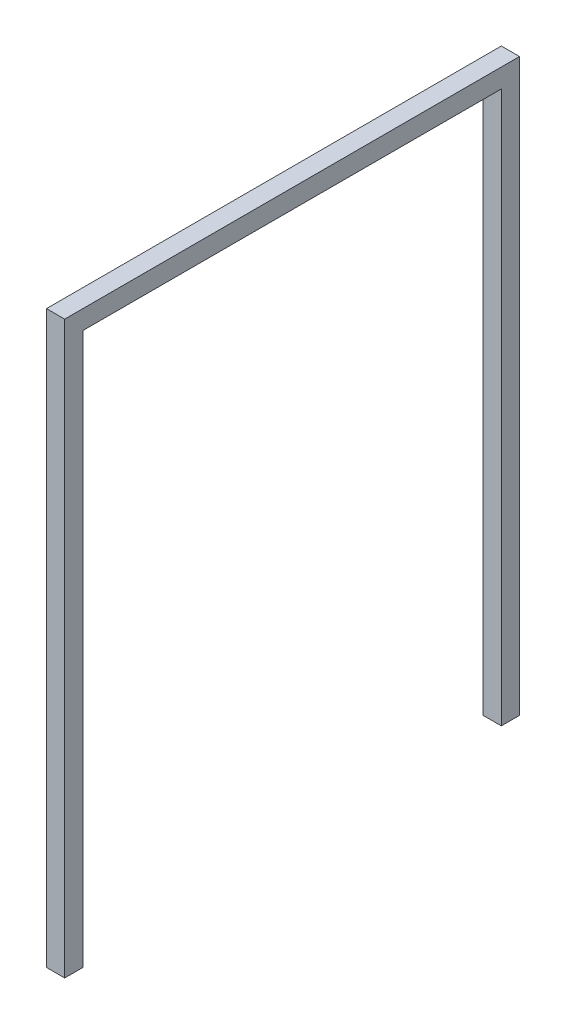
ISO-10303-21;
HEADER;
FILE_DESCRIPTION(('STEP AP214'),'2;1');
FILE_NAME('part.step','',(''),(''),'','','');
FILE_SCHEMA(('AUTOMOTIVE_DESIGN { 1 0 10303 214 1 1 1 1 }'));
ENDSEC;
DATA;
#1=APPLICATION_CONTEXT('core data for automotive mechanical design processes');
#2=APPLICATION_PROTOCOL_DEFINITION('international standard','automotive_design',2000,#1);
#3=PRODUCT_CONTEXT('',#1,'mechanical');
#4=PRODUCT('Part','Part','',(#3));
#5=PRODUCT_RELATED_PRODUCT_CATEGORY('part','',(#4));
#6=PRODUCT_DEFINITION_FORMATION('','',#4);
#7=PRODUCT_DEFINITION_CONTEXT('part definition',#1,'design');
#8=PRODUCT_DEFINITION('design','',#6,#7);
#9=PRODUCT_DEFINITION_SHAPE('','',#8);
#10=(LENGTH_UNIT() NAMED_UNIT(*) SI_UNIT(.MILLI.,.METRE.));
#11=(NAMED_UNIT(*) PLANE_ANGLE_UNIT() SI_UNIT($,.RADIAN.));
#12=(NAMED_UNIT(*) SI_UNIT($,.STERADIAN.) SOLID_ANGLE_UNIT());
#13=UNCERTAINTY_MEASURE_WITH_UNIT(LENGTH_MEASURE(1.E-05),#10,'distance_accuracy_value','');
#14=(GEOMETRIC_REPRESENTATION_CONTEXT(3) GLOBAL_UNCERTAINTY_ASSIGNED_CONTEXT((#13)) GLOBAL_UNIT_ASSIGNED_CONTEXT((#10,
#11,#12)) REPRESENTATION_CONTEXT('',''));
#15=CARTESIAN_POINT('',(0.,0.,0.));
#16=DIRECTION('',(0.,0.,1.));
#17=DIRECTION('',(1.,0.,0.));
#18=AXIS2_PLACEMENT_3D('',#15,#16,#17);
#19=CARTESIAN_POINT('',(0.,762.,0.));
#20=DIRECTION('',(1.,0.,0.));
#21=DIRECTION('',(0.,0.,-1.));
#22=AXIS2_PLACEMENT_3D('',#19,#20,#21);
#23=PLANE('',#22);
#24=DIRECTION('',(0.,0.,1.));
#25=VECTOR('',#24,1.);
#26=CARTESIAN_POINT('',(0.,0.,0.));
#27=LINE('',#26,#25);
#28=CARTESIAN_POINT('',(0.,0.,-24.295652173913));
#29=VERTEX_POINT('',#28);
#30=CARTESIAN_POINT('',(0.,0.,0.));
#31=VERTEX_POINT('',#30);
#32=EDGE_CURVE('E83',#29,#31,#27,.T.);
#33=ORIENTED_EDGE('',*,*,#32,.T.);
#34=DIRECTION('',(0.,-1.,0.));
#35=VECTOR('',#34,1.);
#36=CARTESIAN_POINT('',(0.,762.,0.));
#37=LINE('',#36,#35);
#38=CARTESIAN_POINT('',(0.,762.,0.));
#39=VERTEX_POINT('',#38);
#40=EDGE_CURVE('E11',#39,#31,#37,.T.);
#41=ORIENTED_EDGE('',*,*,#40,.F.);
#42=DIRECTION('',(0.,0.,1.));
#43=VECTOR('',#42,1.);
#44=CARTESIAN_POINT('',(0.,762.,0.));
#45=LINE('',#44,#43);
#46=CARTESIAN_POINT('',(0.,762.,-607.391304347826));
#47=VERTEX_POINT('',#46);
#48=EDGE_CURVE('E98',#47,#39,#45,.T.);
#49=ORIENTED_EDGE('',*,*,#48,.F.);
#50=DIRECTION('',(0.,-1.,0.));
#51=VECTOR('',#50,1.);
#52=CARTESIAN_POINT('',(0.,762.,-607.391304347826));
#53=LINE('',#52,#51);
#54=CARTESIAN_POINT('',(0.,0.,-607.391304347826));
#55=VERTEX_POINT('',#54);
#56=EDGE_CURVE('E124',#47,#55,#53,.T.);
#57=ORIENTED_EDGE('',*,*,#56,.T.);
#58=DIRECTION('',(0.,0.,1.));
#59=VECTOR('',#58,1.);
#60=CARTESIAN_POINT('',(0.,0.,-583.095652173913));
#61=LINE('',#60,#59);
#62=CARTESIAN_POINT('',(0.,0.,-583.095652173913));
#63=VERTEX_POINT('',#62);
#64=EDGE_CURVE('E176',#55,#63,#61,.T.);
#65=ORIENTED_EDGE('',*,*,#64,.T.);
#66=DIRECTION('',(0.,-1.,0.));
#67=VECTOR('',#66,1.);
#68=CARTESIAN_POINT('',(0.,762.,-583.095652173913));
#69=LINE('',#68,#67);
#70=CARTESIAN_POINT('',(0.,736.6,-583.095652173913));
#71=VERTEX_POINT('',#70);
#72=EDGE_CURVE('E143',#71,#63,#69,.T.);
#73=ORIENTED_EDGE('',*,*,#72,.F.);
#74=DIRECTION('',(0.,0.,-1.));
#75=VECTOR('',#74,1.);
#76=CARTESIAN_POINT('',(0.,736.6,-24.2956521739131));
#77=LINE('',#76,#75);
#78=CARTESIAN_POINT('',(0.,736.6,-24.2956521739131));
#79=VERTEX_POINT('',#78);
#80=EDGE_CURVE('E86',#79,#71,#77,.T.);
#81=ORIENTED_EDGE('',*,*,#80,.F.);
#82=DIRECTION('',(0.,-1.,0.));
#83=VECTOR('',#82,1.);
#84=CARTESIAN_POINT('',(0.,762.,-24.295652173913));
#85=LINE('',#84,#83);
#86=EDGE_CURVE('E79',#79,#29,#85,.T.);
#87=ORIENTED_EDGE('',*,*,#86,.T.);
#88=EDGE_LOOP('',(#33,#41,#49,#57,#65,#73,#81,#87));
#89=FACE_BOUND('',#88,.T.);
#90=ADVANCED_FACE('F36',(#89),#23,.F.);
#91=CARTESIAN_POINT('',(0.,762.,0.));
#92=DIRECTION('',(0.,0.,-1.));
#93=DIRECTION('',(-1.,0.,0.));
#94=AXIS2_PLACEMENT_3D('',#91,#92,#93);
#95=PLANE('',#94);
#96=DIRECTION('',(1.,0.,0.));
#97=VECTOR('',#96,1.);
#98=CARTESIAN_POINT('',(0.,0.,0.));
#99=LINE('',#98,#97);
#100=CARTESIAN_POINT('',(24.295652173913,0.,0.));
#101=VERTEX_POINT('',#100);
#102=EDGE_CURVE('E102',#31,#101,#99,.T.);
#103=ORIENTED_EDGE('',*,*,#102,.T.);
#104=DIRECTION('',(0.,-1.,0.));
#105=VECTOR('',#104,1.);
#106=CARTESIAN_POINT('',(24.295652173913,762.,0.));
#107=LINE('',#106,#105);
#108=CARTESIAN_POINT('',(24.295652173913,762.,0.));
#109=VERTEX_POINT('',#108);
#110=EDGE_CURVE('E43',#109,#101,#107,.T.);
#111=ORIENTED_EDGE('',*,*,#110,.F.);
#112=DIRECTION('',(1.,0.,0.));
#113=VECTOR('',#112,1.);
#114=CARTESIAN_POINT('',(0.,762.,0.));
#115=LINE('',#114,#113);
#116=EDGE_CURVE('E59',#39,#109,#115,.T.);
#117=ORIENTED_EDGE('',*,*,#116,.F.);
#118=ORIENTED_EDGE('',*,*,#40,.T.);
#119=EDGE_LOOP('',(#103,#111,#117,#118));
#120=FACE_BOUND('',#119,.T.);
#121=ADVANCED_FACE('F116',(#120),#95,.F.);
#122=CARTESIAN_POINT('',(24.295652173913,762.,0.));
#123=DIRECTION('',(-1.,0.,0.));
#124=DIRECTION('',(0.,0.,1.));
#125=AXIS2_PLACEMENT_3D('',#122,#123,#124);
#126=PLANE('',#125);
#127=DIRECTION('',(0.,0.,-1.));
#128=VECTOR('',#127,1.);
#129=CARTESIAN_POINT('',(24.295652173913,0.,0.));
#130=LINE('',#129,#128);
#131=CARTESIAN_POINT('',(24.295652173913,0.,-24.295652173913));
#132=VERTEX_POINT('',#131);
#133=EDGE_CURVE('E99',#101,#132,#130,.T.);
#134=ORIENTED_EDGE('',*,*,#133,.T.);
#135=DIRECTION('',(0.,-1.,0.));
#136=VECTOR('',#135,1.);
#137=CARTESIAN_POINT('',(24.295652173913,762.,-24.295652173913));
#138=LINE('',#137,#136);
#139=CARTESIAN_POINT('',(24.295652173913,736.6,-24.295652173913));
#140=VERTEX_POINT('',#139);
#141=EDGE_CURVE('E88',#140,#132,#138,.T.);
#142=ORIENTED_EDGE('',*,*,#141,.F.);
#143=DIRECTION('',(0.,0.,-1.));
#144=VECTOR('',#143,1.);
#145=CARTESIAN_POINT('',(24.295652173913,736.6,-24.2956521739131));
#146=LINE('',#145,#144);
#147=CARTESIAN_POINT('',(24.295652173913,736.6,-583.095652173913));
#148=VERTEX_POINT('',#147);
#149=EDGE_CURVE('E50',#140,#148,#146,.T.);
#150=ORIENTED_EDGE('',*,*,#149,.T.);
#151=DIRECTION('',(0.,-1.,0.));
#152=VECTOR('',#151,1.);
#153=CARTESIAN_POINT('',(24.295652173913,762.,-583.095652173913));
#154=LINE('',#153,#152);
#155=CARTESIAN_POINT('',(24.295652173913,0.,-583.095652173913));
#156=VERTEX_POINT('',#155);
#157=EDGE_CURVE('E135',#148,#156,#154,.T.);
#158=ORIENTED_EDGE('',*,*,#157,.T.);
#159=DIRECTION('',(0.,0.,-1.));
#160=VECTOR('',#159,1.);
#161=CARTESIAN_POINT('',(24.295652173913,0.,-583.095652173913));
#162=LINE('',#161,#160);
#163=CARTESIAN_POINT('',(24.295652173913,0.,-607.391304347826));
#164=VERTEX_POINT('',#163);
#165=EDGE_CURVE('E175',#156,#164,#162,.T.);
#166=ORIENTED_EDGE('',*,*,#165,.T.);
#167=DIRECTION('',(0.,-1.,0.));
#168=VECTOR('',#167,1.);
#169=CARTESIAN_POINT('',(24.295652173913,762.,-607.391304347826));
#170=LINE('',#169,#168);
#171=CARTESIAN_POINT('',(24.295652173913,762.,-607.391304347826));
#172=VERTEX_POINT('',#171);
#173=EDGE_CURVE('E142',#172,#164,#170,.T.);
#174=ORIENTED_EDGE('',*,*,#173,.F.);
#175=DIRECTION('',(0.,0.,-1.));
#176=VECTOR('',#175,1.);
#177=CARTESIAN_POINT('',(24.295652173913,762.,0.));
#178=LINE('',#177,#176);
#179=EDGE_CURVE('E89',#109,#172,#178,.T.);
#180=ORIENTED_EDGE('',*,*,#179,.F.);
#181=ORIENTED_EDGE('',*,*,#110,.T.);
#182=EDGE_LOOP('',(#134,#142,#150,#158,#166,#174,#180,#181));
#183=FACE_BOUND('',#182,.T.);
#184=ADVANCED_FACE('F113',(#183),#126,.F.);
#185=CARTESIAN_POINT('',(0.,762.,-24.295652173913));
#186=DIRECTION('',(0.,0.,1.));
#187=DIRECTION('',(1.,0.,0.));
#188=AXIS2_PLACEMENT_3D('',#185,#186,#187);
#189=PLANE('',#188);
#190=ORIENTED_EDGE('',*,*,#86,.F.);
#191=DIRECTION('',(1.,0.,0.));
#192=VECTOR('',#191,1.);
#193=CARTESIAN_POINT('',(0.,736.6,-24.2956521739131));
#194=LINE('',#193,#192);
#195=EDGE_CURVE('E151',#79,#140,#194,.T.);
#196=ORIENTED_EDGE('',*,*,#195,.T.);
#197=ORIENTED_EDGE('',*,*,#141,.T.);
#198=DIRECTION('',(-1.,0.,0.));
#199=VECTOR('',#198,1.);
#200=CARTESIAN_POINT('',(0.,0.,-24.295652173913));
#201=LINE('',#200,#199);
#202=EDGE_CURVE('E92',#132,#29,#201,.T.);
#203=ORIENTED_EDGE('',*,*,#202,.T.);
#204=EDGE_LOOP('',(#190,#196,#197,#203));
#205=FACE_BOUND('',#204,.T.);
#206=ADVANCED_FACE('F93',(#205),#189,.F.);
#207=CARTESIAN_POINT('',(0.,762.,0.));
#208=DIRECTION('',(0.,-1.,0.));
#209=DIRECTION('',(0.,0.,-1.));
#210=AXIS2_PLACEMENT_3D('',#207,#208,#209);
#211=PLANE('',#210);
#212=ORIENTED_EDGE('',*,*,#48,.T.);
#213=ORIENTED_EDGE('',*,*,#116,.T.);
#214=ORIENTED_EDGE('',*,*,#179,.T.);
#215=DIRECTION('',(-1.,0.,0.));
#216=VECTOR('',#215,1.);
#217=CARTESIAN_POINT('',(0.,762.,-607.391304347826));
#218=LINE('',#217,#216);
#219=EDGE_CURVE('E131',#172,#47,#218,.T.);
#220=ORIENTED_EDGE('',*,*,#219,.T.);
#221=EDGE_LOOP('',(#212,#213,#214,#220));
#222=FACE_BOUND('',#221,.T.);
#223=ADVANCED_FACE('F132',(#222),#211,.F.);
#224=CARTESIAN_POINT('',(0.,0.,0.));
#225=DIRECTION('',(0.,-1.,0.));
#226=DIRECTION('',(0.,0.,-1.));
#227=AXIS2_PLACEMENT_3D('',#224,#225,#226);
#228=PLANE('',#227);
#229=ORIENTED_EDGE('',*,*,#32,.F.);
#230=ORIENTED_EDGE('',*,*,#202,.F.);
#231=ORIENTED_EDGE('',*,*,#133,.F.);
#232=ORIENTED_EDGE('',*,*,#102,.F.);
#233=EDGE_LOOP('',(#229,#230,#231,#232));
#234=FACE_BOUND('',#233,.T.);
#235=ADVANCED_FACE('F101',(#234),#228,.T.);
#236=CARTESIAN_POINT('',(0.,736.6,-24.2956521739131));
#237=DIRECTION('',(0.,1.,0.));
#238=DIRECTION('',(0.,0.,1.));
#239=AXIS2_PLACEMENT_3D('',#236,#237,#238);
#240=PLANE('',#239);
#241=DIRECTION('',(1.,0.,0.));
#242=VECTOR('',#241,1.);
#243=CARTESIAN_POINT('',(0.,736.6,-583.095652173913));
#244=LINE('',#243,#242);
#245=EDGE_CURVE('E145',#71,#148,#244,.T.);
#246=ORIENTED_EDGE('',*,*,#245,.T.);
#247=ORIENTED_EDGE('',*,*,#149,.F.);
#248=ORIENTED_EDGE('',*,*,#195,.F.);
#249=ORIENTED_EDGE('',*,*,#80,.T.);
#250=EDGE_LOOP('',(#246,#247,#248,#249));
#251=FACE_BOUND('',#250,.T.);
#252=ADVANCED_FACE('F182',(#251),#240,.F.);
#253=CARTESIAN_POINT('',(0.,762.,-607.391304347826));
#254=DIRECTION('',(0.,0.,1.));
#255=DIRECTION('',(1.,0.,0.));
#256=AXIS2_PLACEMENT_3D('',#253,#254,#255);
#257=PLANE('',#256);
#258=DIRECTION('',(-1.,0.,0.));
#259=VECTOR('',#258,1.);
#260=CARTESIAN_POINT('',(0.,0.,-607.391304347826));
#261=LINE('',#260,#259);
#262=EDGE_CURVE('E141',#164,#55,#261,.T.);
#263=ORIENTED_EDGE('',*,*,#262,.T.);
#264=ORIENTED_EDGE('',*,*,#56,.F.);
#265=ORIENTED_EDGE('',*,*,#219,.F.);
#266=ORIENTED_EDGE('',*,*,#173,.T.);
#267=EDGE_LOOP('',(#263,#264,#265,#266));
#268=FACE_BOUND('',#267,.T.);
#269=ADVANCED_FACE('F139',(#268),#257,.F.);
#270=CARTESIAN_POINT('',(0.,762.,-583.095652173913));
#271=DIRECTION('',(0.,0.,-1.));
#272=DIRECTION('',(-1.,0.,0.));
#273=AXIS2_PLACEMENT_3D('',#270,#271,#272);
#274=PLANE('',#273);
#275=ORIENTED_EDGE('',*,*,#245,.F.);
#276=ORIENTED_EDGE('',*,*,#72,.T.);
#277=DIRECTION('',(1.,0.,0.));
#278=VECTOR('',#277,1.);
#279=CARTESIAN_POINT('',(0.,0.,-583.095652173913));
#280=LINE('',#279,#278);
#281=EDGE_CURVE('E136',#63,#156,#280,.T.);
#282=ORIENTED_EDGE('',*,*,#281,.T.);
#283=ORIENTED_EDGE('',*,*,#157,.F.);
#284=EDGE_LOOP('',(#275,#276,#282,#283));
#285=FACE_BOUND('',#284,.T.);
#286=ADVANCED_FACE('F181',(#285),#274,.F.);
#287=CARTESIAN_POINT('',(0.,0.,0.));
#288=DIRECTION('',(0.,-1.,0.));
#289=DIRECTION('',(0.,0.,-1.));
#290=AXIS2_PLACEMENT_3D('',#287,#288,#289);
#291=PLANE('',#290);
#292=ORIENTED_EDGE('',*,*,#165,.F.);
#293=ORIENTED_EDGE('',*,*,#281,.F.);
#294=ORIENTED_EDGE('',*,*,#64,.F.);
#295=ORIENTED_EDGE('',*,*,#262,.F.);
#296=EDGE_LOOP('',(#292,#293,#294,#295));
#297=FACE_BOUND('',#296,.T.);
#298=ADVANCED_FACE('F173',(#297),#291,.T.);
#299=CLOSED_SHELL('',(#90,#121,#184,#206,#223,#235,#252,#269,#286,#298));
#300=MANIFOLD_SOLID_BREP('B2',#299);
#301=ADVANCED_BREP_SHAPE_REPRESENTATION('',(#18,#300),#14);
#302=SHAPE_DEFINITION_REPRESENTATION(#9,#301);
ENDSEC;
END-ISO-10303-21;
